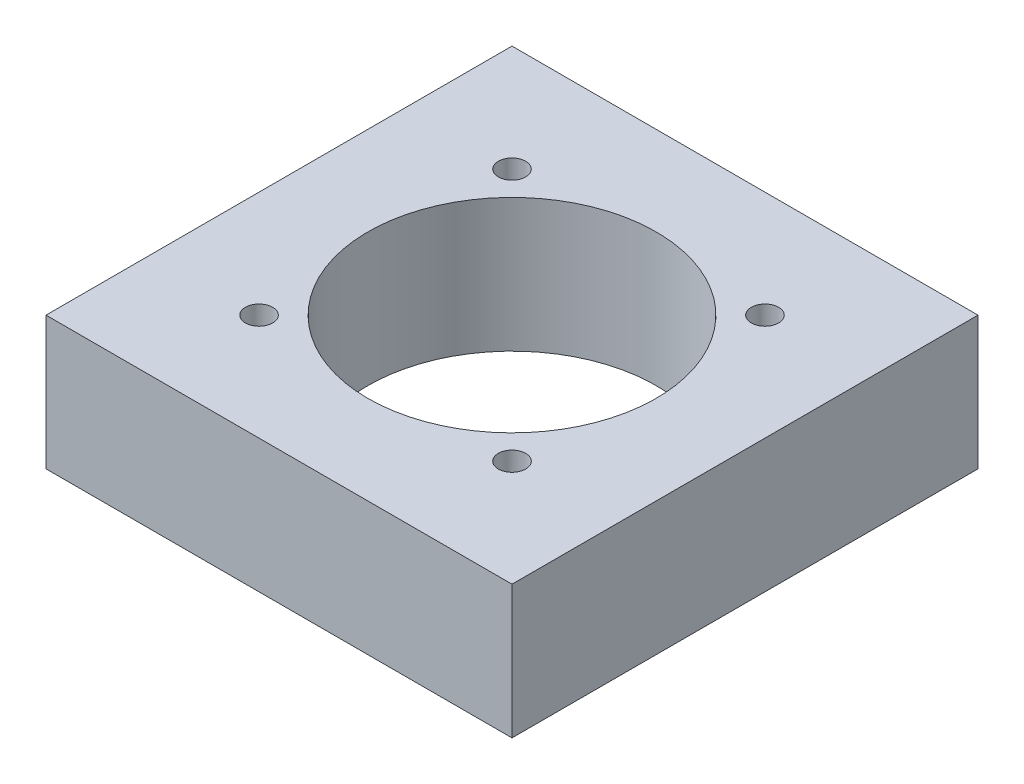
ISO-10303-21;
HEADER;
FILE_DESCRIPTION(('STEP AP214'),'2;1');
FILE_NAME('part.step','',(''),(''),'','','');
FILE_SCHEMA(('AUTOMOTIVE_DESIGN { 1 0 10303 214 1 1 1 1 }'));
ENDSEC;
DATA;
#1=APPLICATION_CONTEXT('core data for automotive mechanical design processes');
#2=APPLICATION_PROTOCOL_DEFINITION('international standard','automotive_design',2000,#1);
#3=PRODUCT_CONTEXT('',#1,'mechanical');
#4=PRODUCT('Part','Part','',(#3));
#5=PRODUCT_RELATED_PRODUCT_CATEGORY('part','',(#4));
#6=PRODUCT_DEFINITION_FORMATION('','',#4);
#7=PRODUCT_DEFINITION_CONTEXT('part definition',#1,'design');
#8=PRODUCT_DEFINITION('design','',#6,#7);
#9=PRODUCT_DEFINITION_SHAPE('','',#8);
#10=(LENGTH_UNIT() NAMED_UNIT(*) SI_UNIT(.MILLI.,.METRE.));
#11=(NAMED_UNIT(*) PLANE_ANGLE_UNIT() SI_UNIT($,.RADIAN.));
#12=(NAMED_UNIT(*) SI_UNIT($,.STERADIAN.) SOLID_ANGLE_UNIT());
#13=UNCERTAINTY_MEASURE_WITH_UNIT(LENGTH_MEASURE(1.E-05),#10,'distance_accuracy_value','');
#14=(GEOMETRIC_REPRESENTATION_CONTEXT(3) GLOBAL_UNCERTAINTY_ASSIGNED_CONTEXT((#13)) GLOBAL_UNIT_ASSIGNED_CONTEXT((#10,
#11,#12)) REPRESENTATION_CONTEXT('',''));
#15=CARTESIAN_POINT('',(0.,0.,0.));
#16=DIRECTION('',(0.,0.,1.));
#17=DIRECTION('',(1.,0.,0.));
#18=AXIS2_PLACEMENT_3D('',#15,#16,#17);
#19=CARTESIAN_POINT('',(35.,-20.,35.));
#20=DIRECTION('',(1.,0.,0.));
#21=DIRECTION('',(0.,0.,-1.));
#22=AXIS2_PLACEMENT_3D('',#19,#20,#21);
#23=PLANE('',#22);
#24=DIRECTION('',(0.,0.,-1.));
#25=VECTOR('',#24,1.);
#26=CARTESIAN_POINT('',(35.,0.,35.));
#27=LINE('',#26,#25);
#28=CARTESIAN_POINT('',(35.,0.,35.));
#29=VERTEX_POINT('',#28);
#30=CARTESIAN_POINT('',(35.,0.,-35.));
#31=VERTEX_POINT('',#30);
#32=EDGE_CURVE('E98',#29,#31,#27,.T.);
#33=ORIENTED_EDGE('',*,*,#32,.F.);
#34=DIRECTION('',(0.,1.,0.));
#35=VECTOR('',#34,1.);
#36=CARTESIAN_POINT('',(35.,-20.,35.));
#37=LINE('',#36,#35);
#38=CARTESIAN_POINT('',(35.,-20.,35.));
#39=VERTEX_POINT('',#38);
#40=EDGE_CURVE('E11',#39,#29,#37,.T.);
#41=ORIENTED_EDGE('',*,*,#40,.F.);
#42=DIRECTION('',(0.,0.,-1.));
#43=VECTOR('',#42,1.);
#44=CARTESIAN_POINT('',(35.,-20.,35.));
#45=LINE('',#44,#43);
#46=CARTESIAN_POINT('',(35.,-20.,-35.));
#47=VERTEX_POINT('',#46);
#48=EDGE_CURVE('E91',#39,#47,#45,.T.);
#49=ORIENTED_EDGE('',*,*,#48,.T.);
#50=DIRECTION('',(0.,1.,0.));
#51=VECTOR('',#50,1.);
#52=CARTESIAN_POINT('',(35.,-20.,-35.));
#53=LINE('',#52,#51);
#54=EDGE_CURVE('E36',#47,#31,#53,.T.);
#55=ORIENTED_EDGE('',*,*,#54,.T.);
#56=EDGE_LOOP('',(#33,#41,#49,#55));
#57=FACE_BOUND('',#56,.T.);
#58=ADVANCED_FACE('F33',(#57),#23,.T.);
#59=CARTESIAN_POINT('',(-35.,-20.,35.));
#60=DIRECTION('',(0.,0.,1.));
#61=DIRECTION('',(1.,0.,0.));
#62=AXIS2_PLACEMENT_3D('',#59,#60,#61);
#63=PLANE('',#62);
#64=DIRECTION('',(1.,0.,0.));
#65=VECTOR('',#64,1.);
#66=CARTESIAN_POINT('',(-35.,0.,35.));
#67=LINE('',#66,#65);
#68=CARTESIAN_POINT('',(-35.,0.,35.));
#69=VERTEX_POINT('',#68);
#70=EDGE_CURVE('E93',#69,#29,#67,.T.);
#71=ORIENTED_EDGE('',*,*,#70,.F.);
#72=DIRECTION('',(0.,1.,0.));
#73=VECTOR('',#72,1.);
#74=CARTESIAN_POINT('',(-35.,-20.,35.));
#75=LINE('',#74,#73);
#76=CARTESIAN_POINT('',(-35.,-20.,35.));
#77=VERTEX_POINT('',#76);
#78=EDGE_CURVE('E42',#77,#69,#75,.T.);
#79=ORIENTED_EDGE('',*,*,#78,.F.);
#80=DIRECTION('',(1.,0.,0.));
#81=VECTOR('',#80,1.);
#82=CARTESIAN_POINT('',(-35.,-20.,35.));
#83=LINE('',#82,#81);
#84=EDGE_CURVE('E88',#77,#39,#83,.T.);
#85=ORIENTED_EDGE('',*,*,#84,.T.);
#86=ORIENTED_EDGE('',*,*,#40,.T.);
#87=EDGE_LOOP('',(#71,#79,#85,#86));
#88=FACE_BOUND('',#87,.T.);
#89=ADVANCED_FACE('F109',(#88),#63,.T.);
#90=CARTESIAN_POINT('',(-35.,-20.,35.));
#91=DIRECTION('',(-1.,0.,0.));
#92=DIRECTION('',(0.,0.,1.));
#93=AXIS2_PLACEMENT_3D('',#90,#91,#92);
#94=PLANE('',#93);
#95=DIRECTION('',(0.,0.,1.));
#96=VECTOR('',#95,1.);
#97=CARTESIAN_POINT('',(-35.,0.,35.));
#98=LINE('',#97,#96);
#99=CARTESIAN_POINT('',(-35.,0.,-35.));
#100=VERTEX_POINT('',#99);
#101=EDGE_CURVE('E83',#100,#69,#98,.T.);
#102=ORIENTED_EDGE('',*,*,#101,.F.);
#103=DIRECTION('',(0.,1.,0.));
#104=VECTOR('',#103,1.);
#105=CARTESIAN_POINT('',(-35.,-20.,-35.));
#106=LINE('',#105,#104);
#107=CARTESIAN_POINT('',(-35.,-20.,-35.));
#108=VERTEX_POINT('',#107);
#109=EDGE_CURVE('E78',#108,#100,#106,.T.);
#110=ORIENTED_EDGE('',*,*,#109,.F.);
#111=DIRECTION('',(0.,0.,1.));
#112=VECTOR('',#111,1.);
#113=CARTESIAN_POINT('',(-35.,-20.,35.));
#114=LINE('',#113,#112);
#115=EDGE_CURVE('E81',#108,#77,#114,.T.);
#116=ORIENTED_EDGE('',*,*,#115,.T.);
#117=ORIENTED_EDGE('',*,*,#78,.T.);
#118=EDGE_LOOP('',(#102,#110,#116,#117));
#119=FACE_BOUND('',#118,.T.);
#120=ADVANCED_FACE('F80',(#119),#94,.T.);
#121=CARTESIAN_POINT('',(-35.,-20.,-35.));
#122=DIRECTION('',(0.,0.,-1.));
#123=DIRECTION('',(-1.,0.,0.));
#124=AXIS2_PLACEMENT_3D('',#121,#122,#123);
#125=PLANE('',#124);
#126=DIRECTION('',(-1.,0.,0.));
#127=VECTOR('',#126,1.);
#128=CARTESIAN_POINT('',(-35.,0.,-35.));
#129=LINE('',#128,#127);
#130=EDGE_CURVE('E101',#31,#100,#129,.T.);
#131=ORIENTED_EDGE('',*,*,#130,.F.);
#132=ORIENTED_EDGE('',*,*,#54,.F.);
#133=DIRECTION('',(-1.,0.,0.));
#134=VECTOR('',#133,1.);
#135=CARTESIAN_POINT('',(-35.,-20.,-35.));
#136=LINE('',#135,#134);
#137=EDGE_CURVE('E87',#47,#108,#136,.T.);
#138=ORIENTED_EDGE('',*,*,#137,.T.);
#139=ORIENTED_EDGE('',*,*,#109,.T.);
#140=EDGE_LOOP('',(#131,#132,#138,#139));
#141=FACE_BOUND('',#140,.T.);
#142=ADVANCED_FACE('F90',(#141),#125,.T.);
#143=CARTESIAN_POINT('',(0.,-20.,0.));
#144=DIRECTION('',(0.,-1.,0.));
#145=DIRECTION('',(0.,0.,-1.));
#146=AXIS2_PLACEMENT_3D('',#143,#144,#145);
#147=PLANE('',#146);
#148=CARTESIAN_POINT('',(0.,-20.,0.));
#149=DIRECTION('',(0.,1.,0.));
#150=DIRECTION('',(0.,0.,1.));
#151=AXIS2_PLACEMENT_3D('',#148,#149,#150);
#152=CIRCLE('',#151,21.6588510841306);
#153=CARTESIAN_POINT('',(0.,-20.,21.6588510841306));
#154=VERTEX_POINT('',#153);
#155=EDGE_CURVE('E155',#154,#154,#152,.T.);
#156=ORIENTED_EDGE('',*,*,#155,.T.);
#157=EDGE_LOOP('',(#156));
#158=FACE_BOUND('',#157,.T.);
#159=CARTESIAN_POINT('',(19.,-20.,-19.));
#160=DIRECTION('',(0.,1.,0.));
#161=DIRECTION('',(0.,0.,1.));
#162=AXIS2_PLACEMENT_3D('',#159,#160,#161);
#163=CIRCLE('',#162,2.05000000000001);
#164=CARTESIAN_POINT('',(19.,-20.,-16.95));
#165=VERTEX_POINT('',#164);
#166=EDGE_CURVE('E163',#165,#165,#163,.T.);
#167=ORIENTED_EDGE('',*,*,#166,.T.);
#168=EDGE_LOOP('',(#167));
#169=FACE_BOUND('',#168,.T.);
#170=CARTESIAN_POINT('',(-19.,-20.,19.));
#171=DIRECTION('',(0.,1.,0.));
#172=DIRECTION('',(0.,0.,-1.));
#173=AXIS2_PLACEMENT_3D('',#170,#171,#172);
#174=CIRCLE('',#173,2.05);
#175=CARTESIAN_POINT('',(-19.,-20.,16.95));
#176=VERTEX_POINT('',#175);
#177=EDGE_CURVE('E169',#176,#176,#174,.T.);
#178=ORIENTED_EDGE('',*,*,#177,.T.);
#179=EDGE_LOOP('',(#178));
#180=FACE_BOUND('',#179,.T.);
#181=CARTESIAN_POINT('',(19.,-20.,19.));
#182=DIRECTION('',(0.,1.,0.));
#183=DIRECTION('',(0.,0.,-1.));
#184=AXIS2_PLACEMENT_3D('',#181,#182,#183);
#185=CIRCLE('',#184,2.05000000000001);
#186=CARTESIAN_POINT('',(19.,-20.,16.95));
#187=VERTEX_POINT('',#186);
#188=EDGE_CURVE('E175',#187,#187,#185,.T.);
#189=ORIENTED_EDGE('',*,*,#188,.T.);
#190=EDGE_LOOP('',(#189));
#191=FACE_BOUND('',#190,.T.);
#192=CARTESIAN_POINT('',(-19.,-20.,-19.));
#193=DIRECTION('',(0.,1.,0.));
#194=DIRECTION('',(0.,0.,1.));
#195=AXIS2_PLACEMENT_3D('',#192,#193,#194);
#196=CIRCLE('',#195,2.05);
#197=CARTESIAN_POINT('',(-19.,-20.,-16.95));
#198=VERTEX_POINT('',#197);
#199=EDGE_CURVE('E102',#198,#198,#196,.T.);
#200=ORIENTED_EDGE('',*,*,#199,.T.);
#201=EDGE_LOOP('',(#200));
#202=FACE_BOUND('',#201,.T.);
#203=ORIENTED_EDGE('',*,*,#48,.F.);
#204=ORIENTED_EDGE('',*,*,#84,.F.);
#205=ORIENTED_EDGE('',*,*,#115,.F.);
#206=ORIENTED_EDGE('',*,*,#137,.F.);
#207=EDGE_LOOP('',(#203,#204,#205,#206));
#208=FACE_BOUND('',#207,.T.);
#209=ADVANCED_FACE('F86',(#158,#169,#180,#191,#202,#208),#147,.T.);
#210=CARTESIAN_POINT('',(0.,0.,0.));
#211=DIRECTION('',(0.,-1.,0.));
#212=DIRECTION('',(0.,0.,-1.));
#213=AXIS2_PLACEMENT_3D('',#210,#211,#212);
#214=PLANE('',#213);
#215=CARTESIAN_POINT('',(0.,0.,0.));
#216=DIRECTION('',(0.,1.,0.));
#217=DIRECTION('',(0.,0.,1.));
#218=AXIS2_PLACEMENT_3D('',#215,#216,#217);
#219=CIRCLE('',#218,21.6588510841306);
#220=CARTESIAN_POINT('',(0.,0.,21.6588510841306));
#221=VERTEX_POINT('',#220);
#222=EDGE_CURVE('E158',#221,#221,#219,.T.);
#223=ORIENTED_EDGE('',*,*,#222,.F.);
#224=EDGE_LOOP('',(#223));
#225=FACE_BOUND('',#224,.T.);
#226=CARTESIAN_POINT('',(19.,0.,-19.));
#227=DIRECTION('',(0.,1.,0.));
#228=DIRECTION('',(0.,0.,1.));
#229=AXIS2_PLACEMENT_3D('',#226,#227,#228);
#230=CIRCLE('',#229,2.05000000000001);
#231=CARTESIAN_POINT('',(19.,0.,-16.95));
#232=VERTEX_POINT('',#231);
#233=EDGE_CURVE('E160',#232,#232,#230,.T.);
#234=ORIENTED_EDGE('',*,*,#233,.F.);
#235=EDGE_LOOP('',(#234));
#236=FACE_BOUND('',#235,.T.);
#237=CARTESIAN_POINT('',(-19.,0.,19.));
#238=DIRECTION('',(0.,1.,0.));
#239=DIRECTION('',(0.,0.,-1.));
#240=AXIS2_PLACEMENT_3D('',#237,#238,#239);
#241=CIRCLE('',#240,2.05);
#242=CARTESIAN_POINT('',(-19.,0.,16.95));
#243=VERTEX_POINT('',#242);
#244=EDGE_CURVE('E166',#243,#243,#241,.T.);
#245=ORIENTED_EDGE('',*,*,#244,.F.);
#246=EDGE_LOOP('',(#245));
#247=FACE_BOUND('',#246,.T.);
#248=CARTESIAN_POINT('',(19.,0.,19.));
#249=DIRECTION('',(0.,1.,0.));
#250=DIRECTION('',(0.,0.,-1.));
#251=AXIS2_PLACEMENT_3D('',#248,#249,#250);
#252=CIRCLE('',#251,2.05000000000001);
#253=CARTESIAN_POINT('',(19.,0.,16.95));
#254=VERTEX_POINT('',#253);
#255=EDGE_CURVE('E172',#254,#254,#252,.T.);
#256=ORIENTED_EDGE('',*,*,#255,.F.);
#257=EDGE_LOOP('',(#256));
#258=FACE_BOUND('',#257,.T.);
#259=CARTESIAN_POINT('',(-19.,0.,-19.));
#260=DIRECTION('',(0.,1.,0.));
#261=DIRECTION('',(0.,0.,1.));
#262=AXIS2_PLACEMENT_3D('',#259,#260,#261);
#263=CIRCLE('',#262,2.05);
#264=CARTESIAN_POINT('',(-19.,0.,-16.95));
#265=VERTEX_POINT('',#264);
#266=EDGE_CURVE('E178',#265,#265,#263,.T.);
#267=ORIENTED_EDGE('',*,*,#266,.F.);
#268=EDGE_LOOP('',(#267));
#269=FACE_BOUND('',#268,.T.);
#270=ORIENTED_EDGE('',*,*,#32,.T.);
#271=ORIENTED_EDGE('',*,*,#130,.T.);
#272=ORIENTED_EDGE('',*,*,#101,.T.);
#273=ORIENTED_EDGE('',*,*,#70,.T.);
#274=EDGE_LOOP('',(#270,#271,#272,#273));
#275=FACE_BOUND('',#274,.T.);
#276=ADVANCED_FACE('F108',(#225,#236,#247,#258,#269,#275),#214,.F.);
#277=CARTESIAN_POINT('',(-19.,-20.,-19.));
#278=DIRECTION('',(0.,1.,0.));
#279=DIRECTION('',(0.,0.,1.));
#280=AXIS2_PLACEMENT_3D('',#277,#278,#279);
#281=CYLINDRICAL_SURFACE('',#280,2.05);
#282=ORIENTED_EDGE('',*,*,#199,.F.);
#283=EDGE_LOOP('',(#282));
#284=FACE_BOUND('',#283,.T.);
#285=ORIENTED_EDGE('',*,*,#266,.T.);
#286=EDGE_LOOP('',(#285));
#287=FACE_BOUND('',#286,.T.);
#288=ADVANCED_FACE('F128',(#284,#287),#281,.F.);
#289=CARTESIAN_POINT('',(19.,-20.,19.));
#290=DIRECTION('',(0.,1.,0.));
#291=DIRECTION('',(0.,0.,1.));
#292=AXIS2_PLACEMENT_3D('',#289,#290,#291);
#293=CYLINDRICAL_SURFACE('',#292,2.05000000000001);
#294=ORIENTED_EDGE('',*,*,#188,.F.);
#295=EDGE_LOOP('',(#294));
#296=FACE_BOUND('',#295,.T.);
#297=ORIENTED_EDGE('',*,*,#255,.T.);
#298=EDGE_LOOP('',(#297));
#299=FACE_BOUND('',#298,.T.);
#300=ADVANCED_FACE('F135',(#296,#299),#293,.F.);
#301=CARTESIAN_POINT('',(-19.,-20.,19.));
#302=DIRECTION('',(0.,1.,0.));
#303=DIRECTION('',(0.,0.,1.));
#304=AXIS2_PLACEMENT_3D('',#301,#302,#303);
#305=CYLINDRICAL_SURFACE('',#304,2.05);
#306=ORIENTED_EDGE('',*,*,#177,.F.);
#307=EDGE_LOOP('',(#306));
#308=FACE_BOUND('',#307,.T.);
#309=ORIENTED_EDGE('',*,*,#244,.T.);
#310=EDGE_LOOP('',(#309));
#311=FACE_BOUND('',#310,.T.);
#312=ADVANCED_FACE('F139',(#308,#311),#305,.F.);
#313=CARTESIAN_POINT('',(19.,-20.,-19.));
#314=DIRECTION('',(0.,1.,0.));
#315=DIRECTION('',(0.,0.,1.));
#316=AXIS2_PLACEMENT_3D('',#313,#314,#315);
#317=CYLINDRICAL_SURFACE('',#316,2.05000000000001);
#318=ORIENTED_EDGE('',*,*,#166,.F.);
#319=EDGE_LOOP('',(#318));
#320=FACE_BOUND('',#319,.T.);
#321=ORIENTED_EDGE('',*,*,#233,.T.);
#322=EDGE_LOOP('',(#321));
#323=FACE_BOUND('',#322,.T.);
#324=ADVANCED_FACE('F143',(#320,#323),#317,.F.);
#325=CARTESIAN_POINT('',(0.,-20.,0.));
#326=DIRECTION('',(0.,1.,0.));
#327=DIRECTION('',(0.,0.,1.));
#328=AXIS2_PLACEMENT_3D('',#325,#326,#327);
#329=CYLINDRICAL_SURFACE('',#328,21.6588510841306);
#330=ORIENTED_EDGE('',*,*,#155,.F.);
#331=EDGE_LOOP('',(#330));
#332=FACE_BOUND('',#331,.T.);
#333=ORIENTED_EDGE('',*,*,#222,.T.);
#334=EDGE_LOOP('',(#333));
#335=FACE_BOUND('',#334,.T.);
#336=ADVANCED_FACE('F147',(#332,#335),#329,.F.);
#337=CLOSED_SHELL('',(#58,#89,#120,#142,#209,#276,#288,#300,#312,#324,#336));
#338=MANIFOLD_SOLID_BREP('B2',#337);
#339=ADVANCED_BREP_SHAPE_REPRESENTATION('',(#18,#338),#14);
#340=SHAPE_DEFINITION_REPRESENTATION(#9,#339);
ENDSEC;
END-ISO-10303-21;
